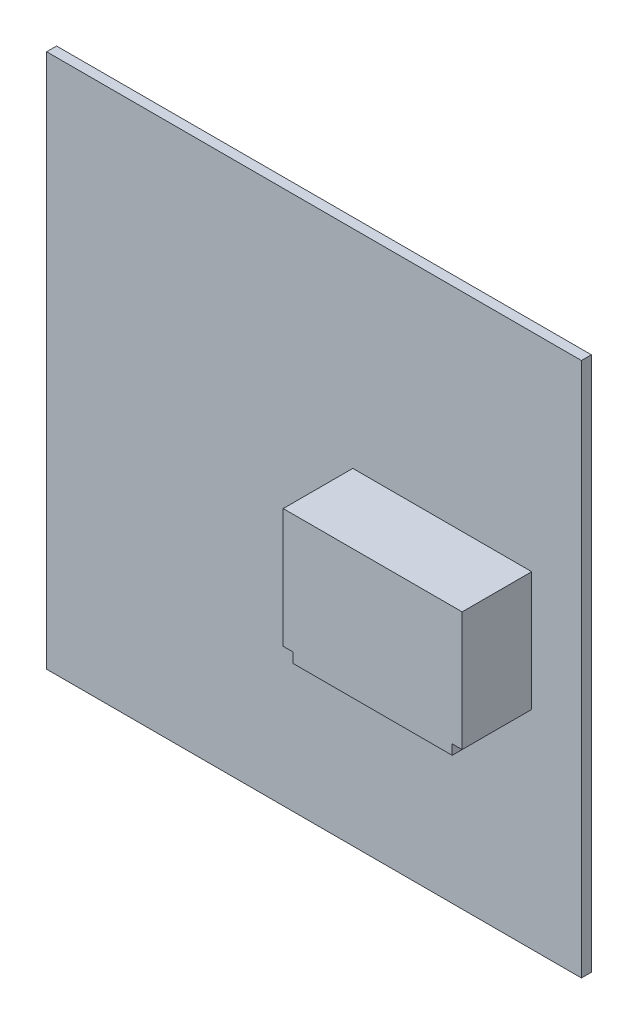
ISO-10303-21;
HEADER;
FILE_DESCRIPTION(('STEP AP214'),'2;1');
FILE_NAME('part.step','',(''),(''),'','','');
FILE_SCHEMA(('AUTOMOTIVE_DESIGN { 1 0 10303 214 1 1 1 1 }'));
ENDSEC;
DATA;
#1=APPLICATION_CONTEXT('core data for automotive mechanical design processes');
#2=APPLICATION_PROTOCOL_DEFINITION('international standard','automotive_design',2000,#1);
#3=PRODUCT_CONTEXT('',#1,'mechanical');
#4=PRODUCT('Part','Part','',(#3));
#5=PRODUCT_RELATED_PRODUCT_CATEGORY('part','',(#4));
#6=PRODUCT_DEFINITION_FORMATION('','',#4);
#7=PRODUCT_DEFINITION_CONTEXT('part definition',#1,'design');
#8=PRODUCT_DEFINITION('design','',#6,#7);
#9=PRODUCT_DEFINITION_SHAPE('','',#8);
#10=(LENGTH_UNIT() NAMED_UNIT(*) SI_UNIT(.MILLI.,.METRE.));
#11=(NAMED_UNIT(*) PLANE_ANGLE_UNIT() SI_UNIT($,.RADIAN.));
#12=(NAMED_UNIT(*) SI_UNIT($,.STERADIAN.) SOLID_ANGLE_UNIT());
#13=UNCERTAINTY_MEASURE_WITH_UNIT(LENGTH_MEASURE(1.E-05),#10,'distance_accuracy_value','');
#14=(GEOMETRIC_REPRESENTATION_CONTEXT(3) GLOBAL_UNCERTAINTY_ASSIGNED_CONTEXT((#13)) GLOBAL_UNIT_ASSIGNED_CONTEXT((#10,
#11,#12)) REPRESENTATION_CONTEXT('',''));
#15=CARTESIAN_POINT('',(0.,0.,0.));
#16=DIRECTION('',(0.,0.,1.));
#17=DIRECTION('',(1.,0.,0.));
#18=AXIS2_PLACEMENT_3D('',#15,#16,#17);
#19=CARTESIAN_POINT('',(403.86,252.73,0.));
#20=DIRECTION('',(-1.,0.,0.));
#21=DIRECTION('',(0.,0.,-1.));
#22=AXIS2_PLACEMENT_3D('',#19,#20,#21);
#23=PLANE('',#22);
#24=DIRECTION('',(0.,1.,0.));
#25=VECTOR('',#24,1.);
#26=CARTESIAN_POINT('',(403.86,252.73,0.));
#27=LINE('',#26,#25);
#28=CARTESIAN_POINT('',(403.86,252.73,0.));
#29=VERTEX_POINT('',#28);
#30=CARTESIAN_POINT('',(403.86,265.43,0.));
#31=VERTEX_POINT('',#30);
#32=EDGE_CURVE('E211',#29,#31,#27,.T.);
#33=ORIENTED_EDGE('',*,*,#32,.F.);
#34=DIRECTION('',(0.,0.,-1.));
#35=VECTOR('',#34,1.);
#36=CARTESIAN_POINT('',(403.86,252.73,0.));
#37=LINE('',#36,#35);
#38=CARTESIAN_POINT('',(403.86,252.73,88.9));
#39=VERTEX_POINT('',#38);
#40=EDGE_CURVE('E202',#39,#29,#37,.T.);
#41=ORIENTED_EDGE('',*,*,#40,.F.);
#42=DIRECTION('',(0.,1.,0.));
#43=VECTOR('',#42,1.);
#44=CARTESIAN_POINT('',(403.86,252.73,88.9));
#45=LINE('',#44,#43);
#46=CARTESIAN_POINT('',(403.86,265.43,88.9));
#47=VERTEX_POINT('',#46);
#48=EDGE_CURVE('E366',#39,#47,#45,.T.);
#49=ORIENTED_EDGE('',*,*,#48,.T.);
#50=DIRECTION('',(0.,0.,-1.));
#51=VECTOR('',#50,1.);
#52=CARTESIAN_POINT('',(403.86,265.43,350.943007190356));
#53=LINE('',#52,#51);
#54=EDGE_CURVE('E347',#47,#31,#53,.T.);
#55=ORIENTED_EDGE('',*,*,#54,.T.);
#56=EDGE_LOOP('',(#33,#41,#49,#55));
#57=FACE_BOUND('',#56,.T.);
#58=ADVANCED_FACE('F45',(#57),#23,.T.);
#59=CARTESIAN_POINT('',(0.,0.,-12.7));
#60=DIRECTION('',(0.,0.,1.));
#61=DIRECTION('',(-1.,0.,0.));
#62=AXIS2_PLACEMENT_3D('',#59,#60,#61);
#63=PLANE('',#62);
#64=DIRECTION('',(0.,-1.,0.));
#65=VECTOR('',#64,1.);
#66=CARTESIAN_POINT('',(0.,0.,-12.7));
#67=LINE('',#66,#65);
#68=CARTESIAN_POINT('',(0.,683.26,-12.7));
#69=VERTEX_POINT('',#68);
#70=CARTESIAN_POINT('',(0.,0.,-12.7));
#71=VERTEX_POINT('',#70);
#72=EDGE_CURVE('E243',#69,#71,#67,.T.);
#73=ORIENTED_EDGE('',*,*,#72,.F.);
#74=DIRECTION('',(-1.,0.,0.));
#75=VECTOR('',#74,1.);
#76=CARTESIAN_POINT('',(0.,683.26,-12.7));
#77=LINE('',#76,#75);
#78=CARTESIAN_POINT('',(683.26,683.26,-12.7));
#79=VERTEX_POINT('',#78);
#80=EDGE_CURVE('E253',#79,#69,#77,.T.);
#81=ORIENTED_EDGE('',*,*,#80,.F.);
#82=DIRECTION('',(0.,1.,0.));
#83=VECTOR('',#82,1.);
#84=CARTESIAN_POINT('',(683.26,0.,-12.7));
#85=LINE('',#84,#83);
#86=CARTESIAN_POINT('',(683.26,0.,-12.7));
#87=VERTEX_POINT('',#86);
#88=EDGE_CURVE('E250',#87,#79,#85,.T.);
#89=ORIENTED_EDGE('',*,*,#88,.F.);
#90=DIRECTION('',(1.,0.,0.));
#91=VECTOR('',#90,1.);
#92=CARTESIAN_POINT('',(0.,0.,-12.7));
#93=LINE('',#92,#91);
#94=EDGE_CURVE('E246',#71,#87,#93,.T.);
#95=ORIENTED_EDGE('',*,*,#94,.F.);
#96=EDGE_LOOP('',(#73,#81,#89,#95));
#97=FACE_BOUND('',#96,.T.);
#98=DIRECTION('',(0.,-1.,0.));
#99=VECTOR('',#98,1.);
#100=CARTESIAN_POINT('',(403.86,405.13,-12.7));
#101=LINE('',#100,#99);
#102=CARTESIAN_POINT('',(403.86,405.13,-12.7));
#103=VERTEX_POINT('',#102);
#104=CARTESIAN_POINT('',(403.86,278.13,-12.7));
#105=VERTEX_POINT('',#104);
#106=EDGE_CURVE('E216',#103,#105,#101,.T.);
#107=ORIENTED_EDGE('',*,*,#106,.T.);
#108=DIRECTION('',(1.,0.,0.));
#109=VECTOR('',#108,1.);
#110=CARTESIAN_POINT('',(403.86,278.13,-12.7));
#111=LINE('',#110,#109);
#112=CARTESIAN_POINT('',(607.06,278.13,-12.7));
#113=VERTEX_POINT('',#112);
#114=EDGE_CURVE('E221',#105,#113,#111,.T.);
#115=ORIENTED_EDGE('',*,*,#114,.T.);
#116=DIRECTION('',(0.,1.,0.));
#117=VECTOR('',#116,1.);
#118=CARTESIAN_POINT('',(607.06,405.13,-12.7));
#119=LINE('',#118,#117);
#120=CARTESIAN_POINT('',(607.06,405.13,-12.7));
#121=VERTEX_POINT('',#120);
#122=EDGE_CURVE('E224',#113,#121,#119,.T.);
#123=ORIENTED_EDGE('',*,*,#122,.T.);
#124=DIRECTION('',(-1.,0.,0.));
#125=VECTOR('',#124,1.);
#126=CARTESIAN_POINT('',(403.86,405.13,-12.7));
#127=LINE('',#126,#125);
#128=EDGE_CURVE('E227',#121,#103,#127,.T.);
#129=ORIENTED_EDGE('',*,*,#128,.T.);
#130=EDGE_LOOP('',(#107,#115,#123,#129));
#131=FACE_BOUND('',#130,.T.);
#132=ADVANCED_FACE('F284',(#97,#131),#63,.F.);
#133=CARTESIAN_POINT('',(0.,0.,0.));
#134=DIRECTION('',(0.,0.,1.));
#135=DIRECTION('',(-1.,0.,0.));
#136=AXIS2_PLACEMENT_3D('',#133,#134,#135);
#137=PLANE('',#136);
#138=DIRECTION('',(1.,0.,0.));
#139=VECTOR('',#138,1.);
#140=CARTESIAN_POINT('',(0.,265.43,0.));
#141=LINE('',#140,#139);
#142=CARTESIAN_POINT('',(607.06,265.43,0.));
#143=VERTEX_POINT('',#142);
#144=CARTESIAN_POINT('',(619.76,265.43,0.));
#145=VERTEX_POINT('',#144);
#146=EDGE_CURVE('E175',#143,#145,#141,.T.);
#147=ORIENTED_EDGE('',*,*,#146,.F.);
#148=DIRECTION('',(0.,1.,0.));
#149=VECTOR('',#148,1.);
#150=CARTESIAN_POINT('',(607.06,252.73,0.));
#151=LINE('',#150,#149);
#152=CARTESIAN_POINT('',(607.06,252.73,0.));
#153=VERTEX_POINT('',#152);
#154=EDGE_CURVE('E213',#153,#143,#151,.T.);
#155=ORIENTED_EDGE('',*,*,#154,.F.);
#156=DIRECTION('',(1.,0.,0.));
#157=VECTOR('',#156,1.);
#158=CARTESIAN_POINT('',(403.86,252.73,0.));
#159=LINE('',#158,#157);
#160=EDGE_CURVE('E205',#29,#153,#159,.T.);
#161=ORIENTED_EDGE('',*,*,#160,.F.);
#162=ORIENTED_EDGE('',*,*,#32,.T.);
#163=DIRECTION('',(-1.,0.,0.));
#164=VECTOR('',#163,1.);
#165=CARTESIAN_POINT('',(0.,265.43,0.));
#166=LINE('',#165,#164);
#167=CARTESIAN_POINT('',(391.16,265.43,0.));
#168=VERTEX_POINT('',#167);
#169=EDGE_CURVE('E183',#31,#168,#166,.T.);
#170=ORIENTED_EDGE('',*,*,#169,.T.);
#171=DIRECTION('',(0.,1.,0.));
#172=VECTOR('',#171,1.);
#173=CARTESIAN_POINT('',(391.16,0.,0.));
#174=LINE('',#173,#172);
#175=CARTESIAN_POINT('',(391.16,417.83,0.));
#176=VERTEX_POINT('',#175);
#177=EDGE_CURVE('E344',#168,#176,#174,.T.);
#178=ORIENTED_EDGE('',*,*,#177,.T.);
#179=DIRECTION('',(1.,0.,0.));
#180=VECTOR('',#179,1.);
#181=CARTESIAN_POINT('',(0.,417.83,0.));
#182=LINE('',#181,#180);
#183=CARTESIAN_POINT('',(619.76,417.83,0.));
#184=VERTEX_POINT('',#183);
#185=EDGE_CURVE('E341',#176,#184,#182,.T.);
#186=ORIENTED_EDGE('',*,*,#185,.T.);
#187=DIRECTION('',(0.,-1.,0.));
#188=VECTOR('',#187,1.);
#189=CARTESIAN_POINT('',(619.76,0.,0.));
#190=LINE('',#189,#188);
#191=EDGE_CURVE('E171',#184,#145,#190,.T.);
#192=ORIENTED_EDGE('',*,*,#191,.T.);
#193=EDGE_LOOP('',(#147,#155,#161,#162,#170,#178,#186,#192));
#194=FACE_BOUND('',#193,.T.);
#195=DIRECTION('',(0.,-1.,0.));
#196=VECTOR('',#195,1.);
#197=CARTESIAN_POINT('',(0.,0.,0.));
#198=LINE('',#197,#196);
#199=CARTESIAN_POINT('',(0.,683.26,0.));
#200=VERTEX_POINT('',#199);
#201=CARTESIAN_POINT('',(0.,0.,0.));
#202=VERTEX_POINT('',#201);
#203=EDGE_CURVE('E242',#200,#202,#198,.T.);
#204=ORIENTED_EDGE('',*,*,#203,.T.);
#205=DIRECTION('',(1.,0.,0.));
#206=VECTOR('',#205,1.);
#207=CARTESIAN_POINT('',(0.,0.,0.));
#208=LINE('',#207,#206);
#209=CARTESIAN_POINT('',(683.26,0.,0.));
#210=VERTEX_POINT('',#209);
#211=EDGE_CURVE('E259',#202,#210,#208,.T.);
#212=ORIENTED_EDGE('',*,*,#211,.T.);
#213=DIRECTION('',(0.,1.,0.));
#214=VECTOR('',#213,1.);
#215=CARTESIAN_POINT('',(683.26,0.,0.));
#216=LINE('',#215,#214);
#217=CARTESIAN_POINT('',(683.26,683.26,0.));
#218=VERTEX_POINT('',#217);
#219=EDGE_CURVE('E262',#210,#218,#216,.T.);
#220=ORIENTED_EDGE('',*,*,#219,.T.);
#221=DIRECTION('',(-1.,0.,0.));
#222=VECTOR('',#221,1.);
#223=CARTESIAN_POINT('',(0.,683.26,0.));
#224=LINE('',#223,#222);
#225=EDGE_CURVE('E247',#218,#200,#224,.T.);
#226=ORIENTED_EDGE('',*,*,#225,.T.);
#227=EDGE_LOOP('',(#204,#212,#220,#226));
#228=FACE_BOUND('',#227,.T.);
#229=ADVANCED_FACE('F279',(#194,#228),#137,.T.);
#230=CARTESIAN_POINT('',(0.,0.,-12.7));
#231=DIRECTION('',(1.,0.,0.));
#232=DIRECTION('',(0.,0.,1.));
#233=AXIS2_PLACEMENT_3D('',#230,#231,#232);
#234=PLANE('',#233);
#235=ORIENTED_EDGE('',*,*,#203,.F.);
#236=DIRECTION('',(0.,0.,1.));
#237=VECTOR('',#236,1.);
#238=CARTESIAN_POINT('',(0.,683.26,-12.7));
#239=LINE('',#238,#237);
#240=EDGE_CURVE('E256',#69,#200,#239,.T.);
#241=ORIENTED_EDGE('',*,*,#240,.F.);
#242=ORIENTED_EDGE('',*,*,#72,.T.);
#243=DIRECTION('',(0.,0.,1.));
#244=VECTOR('',#243,1.);
#245=CARTESIAN_POINT('',(0.,0.,-12.7));
#246=LINE('',#245,#244);
#247=EDGE_CURVE('E11',#71,#202,#246,.T.);
#248=ORIENTED_EDGE('',*,*,#247,.T.);
#249=EDGE_LOOP('',(#235,#241,#242,#248));
#250=FACE_BOUND('',#249,.T.);
#251=ADVANCED_FACE('F47',(#250),#234,.F.);
#252=CARTESIAN_POINT('',(0.,0.,-12.7));
#253=DIRECTION('',(0.,1.,0.));
#254=DIRECTION('',(0.,0.,-1.));
#255=AXIS2_PLACEMENT_3D('',#252,#253,#254);
#256=PLANE('',#255);
#257=ORIENTED_EDGE('',*,*,#211,.F.);
#258=ORIENTED_EDGE('',*,*,#247,.F.);
#259=ORIENTED_EDGE('',*,*,#94,.T.);
#260=DIRECTION('',(0.,0.,1.));
#261=VECTOR('',#260,1.);
#262=CARTESIAN_POINT('',(683.26,0.,-12.7));
#263=LINE('',#262,#261);
#264=EDGE_CURVE('E53',#87,#210,#263,.T.);
#265=ORIENTED_EDGE('',*,*,#264,.T.);
#266=EDGE_LOOP('',(#257,#258,#259,#265));
#267=FACE_BOUND('',#266,.T.);
#268=ADVANCED_FACE('F272',(#267),#256,.F.);
#269=CARTESIAN_POINT('',(683.26,0.,-12.7));
#270=DIRECTION('',(-1.,0.,0.));
#271=DIRECTION('',(0.,0.,-1.));
#272=AXIS2_PLACEMENT_3D('',#269,#270,#271);
#273=PLANE('',#272);
#274=ORIENTED_EDGE('',*,*,#219,.F.);
#275=ORIENTED_EDGE('',*,*,#264,.F.);
#276=ORIENTED_EDGE('',*,*,#88,.T.);
#277=DIRECTION('',(0.,0.,1.));
#278=VECTOR('',#277,1.);
#279=CARTESIAN_POINT('',(683.26,683.26,-12.7));
#280=LINE('',#279,#278);
#281=EDGE_CURVE('E268',#79,#218,#280,.T.);
#282=ORIENTED_EDGE('',*,*,#281,.T.);
#283=EDGE_LOOP('',(#274,#275,#276,#282));
#284=FACE_BOUND('',#283,.T.);
#285=ADVANCED_FACE('F276',(#284),#273,.F.);
#286=CARTESIAN_POINT('',(0.,683.26,-12.7));
#287=DIRECTION('',(0.,-1.,0.));
#288=DIRECTION('',(1.,0.,0.));
#289=AXIS2_PLACEMENT_3D('',#286,#287,#288);
#290=PLANE('',#289);
#291=ORIENTED_EDGE('',*,*,#225,.F.);
#292=ORIENTED_EDGE('',*,*,#281,.F.);
#293=ORIENTED_EDGE('',*,*,#80,.T.);
#294=ORIENTED_EDGE('',*,*,#240,.T.);
#295=EDGE_LOOP('',(#291,#292,#293,#294));
#296=FACE_BOUND('',#295,.T.);
#297=ADVANCED_FACE('F288',(#296),#290,.F.);
#298=CARTESIAN_POINT('',(403.86,405.13,-12.7));
#299=DIRECTION('',(1.,0.,0.));
#300=DIRECTION('',(0.,1.,0.));
#301=AXIS2_PLACEMENT_3D('',#298,#299,#300);
#302=PLANE('',#301);
#303=DIRECTION('',(0.,0.,1.));
#304=VECTOR('',#303,1.);
#305=CARTESIAN_POINT('',(403.86,278.13,-12.7));
#306=LINE('',#305,#304);
#307=CARTESIAN_POINT('',(403.86,278.13,76.2));
#308=VERTEX_POINT('',#307);
#309=EDGE_CURVE('E239',#105,#308,#306,.T.);
#310=ORIENTED_EDGE('',*,*,#309,.F.);
#311=ORIENTED_EDGE('',*,*,#106,.F.);
#312=DIRECTION('',(0.,0.,1.));
#313=VECTOR('',#312,1.);
#314=CARTESIAN_POINT('',(403.86,405.13,-12.7));
#315=LINE('',#314,#313);
#316=CARTESIAN_POINT('',(403.86,405.13,76.2));
#317=VERTEX_POINT('',#316);
#318=EDGE_CURVE('E230',#103,#317,#315,.T.);
#319=ORIENTED_EDGE('',*,*,#318,.T.);
#320=DIRECTION('',(0.,-1.,0.));
#321=VECTOR('',#320,1.);
#322=CARTESIAN_POINT('',(403.86,1.765254609154E-13,76.2));
#323=LINE('',#322,#321);
#324=EDGE_CURVE('E332',#317,#308,#323,.T.);
#325=ORIENTED_EDGE('',*,*,#324,.T.);
#326=EDGE_LOOP('',(#310,#311,#319,#325));
#327=FACE_BOUND('',#326,.T.);
#328=ADVANCED_FACE('F290',(#327),#302,.T.);
#329=CARTESIAN_POINT('',(403.86,278.13,-12.7));
#330=DIRECTION('',(0.,1.,0.));
#331=DIRECTION('',(0.,0.,-1.));
#332=AXIS2_PLACEMENT_3D('',#329,#330,#331);
#333=PLANE('',#332);
#334=CARTESIAN_POINT('',(566.42,278.13,38.1));
#335=DIRECTION('',(0.,-1.,0.));
#336=DIRECTION('',(0.,0.,-1.));
#337=AXIS2_PLACEMENT_3D('',#334,#335,#336);
#338=CIRCLE('',#337,23.6855);
#339=CARTESIAN_POINT('',(566.42,278.13,14.4145));
#340=VERTEX_POINT('',#339);
#341=EDGE_CURVE('E188',#340,#340,#338,.T.);
#342=ORIENTED_EDGE('',*,*,#341,.T.);
#343=EDGE_LOOP('',(#342));
#344=FACE_BOUND('',#343,.T.);
#345=CARTESIAN_POINT('',(502.92,278.13,38.1));
#346=DIRECTION('',(0.,-1.,0.));
#347=DIRECTION('',(0.,0.,-1.));
#348=AXIS2_PLACEMENT_3D('',#345,#346,#347);
#349=CIRCLE('',#348,19.3674999999999);
#350=CARTESIAN_POINT('',(502.92,278.13,18.7325000000001));
#351=VERTEX_POINT('',#350);
#352=EDGE_CURVE('E194',#351,#351,#349,.T.);
#353=ORIENTED_EDGE('',*,*,#352,.T.);
#354=EDGE_LOOP('',(#353));
#355=FACE_BOUND('',#354,.T.);
#356=CARTESIAN_POINT('',(441.96,278.13,38.1));
#357=DIRECTION('',(0.,-1.,0.));
#358=DIRECTION('',(0.,0.,-1.));
#359=AXIS2_PLACEMENT_3D('',#356,#357,#358);
#360=CIRCLE('',#359,16.0655);
#361=CARTESIAN_POINT('',(441.96,278.13,22.0345));
#362=VERTEX_POINT('',#361);
#363=EDGE_CURVE('E182',#362,#362,#360,.T.);
#364=ORIENTED_EDGE('',*,*,#363,.T.);
#365=EDGE_LOOP('',(#364));
#366=FACE_BOUND('',#365,.T.);
#367=DIRECTION('',(0.,0.,1.));
#368=VECTOR('',#367,1.);
#369=CARTESIAN_POINT('',(607.06,278.13,-12.7));
#370=LINE('',#369,#368);
#371=CARTESIAN_POINT('',(607.06,278.13,76.2));
#372=VERTEX_POINT('',#371);
#373=EDGE_CURVE('E236',#113,#372,#370,.T.);
#374=ORIENTED_EDGE('',*,*,#373,.F.);
#375=ORIENTED_EDGE('',*,*,#114,.F.);
#376=ORIENTED_EDGE('',*,*,#309,.T.);
#377=DIRECTION('',(-1.,0.,0.));
#378=VECTOR('',#377,1.);
#379=CARTESIAN_POINT('',(403.86,278.13,76.2));
#380=LINE('',#379,#378);
#381=EDGE_CURVE('E187',#372,#308,#380,.T.);
#382=ORIENTED_EDGE('',*,*,#381,.F.);
#383=EDGE_LOOP('',(#374,#375,#376,#382));
#384=FACE_BOUND('',#383,.T.);
#385=ADVANCED_FACE('F296',(#344,#355,#366,#384),#333,.T.);
#386=CARTESIAN_POINT('',(607.06,405.13,-12.7));
#387=DIRECTION('',(-1.,0.,0.));
#388=DIRECTION('',(0.,0.,-1.));
#389=AXIS2_PLACEMENT_3D('',#386,#387,#388);
#390=PLANE('',#389);
#391=DIRECTION('',(0.,0.,1.));
#392=VECTOR('',#391,1.);
#393=CARTESIAN_POINT('',(607.06,405.13,-12.7));
#394=LINE('',#393,#392);
#395=CARTESIAN_POINT('',(607.06,405.13,76.2));
#396=VERTEX_POINT('',#395);
#397=EDGE_CURVE('E233',#121,#396,#394,.T.);
#398=ORIENTED_EDGE('',*,*,#397,.F.);
#399=ORIENTED_EDGE('',*,*,#122,.F.);
#400=ORIENTED_EDGE('',*,*,#373,.T.);
#401=DIRECTION('',(0.,1.,0.));
#402=VECTOR('',#401,1.);
#403=CARTESIAN_POINT('',(607.06,0.,76.2));
#404=LINE('',#403,#402);
#405=EDGE_CURVE('E350',#372,#396,#404,.T.);
#406=ORIENTED_EDGE('',*,*,#405,.T.);
#407=EDGE_LOOP('',(#398,#399,#400,#406));
#408=FACE_BOUND('',#407,.T.);
#409=ADVANCED_FACE('F316',(#408),#390,.T.);
#410=CARTESIAN_POINT('',(403.86,405.13,-12.7));
#411=DIRECTION('',(0.,-1.,0.));
#412=DIRECTION('',(1.,0.,0.));
#413=AXIS2_PLACEMENT_3D('',#410,#411,#412);
#414=PLANE('',#413);
#415=ORIENTED_EDGE('',*,*,#318,.F.);
#416=ORIENTED_EDGE('',*,*,#128,.F.);
#417=ORIENTED_EDGE('',*,*,#397,.T.);
#418=DIRECTION('',(-1.,0.,0.));
#419=VECTOR('',#418,1.);
#420=CARTESIAN_POINT('',(-2.2135071553464E-13,405.13,76.2));
#421=LINE('',#420,#419);
#422=EDGE_CURVE('E335',#396,#317,#421,.T.);
#423=ORIENTED_EDGE('',*,*,#422,.T.);
#424=EDGE_LOOP('',(#415,#416,#417,#423));
#425=FACE_BOUND('',#424,.T.);
#426=ADVANCED_FACE('F313',(#425),#414,.T.);
#427=CARTESIAN_POINT('',(607.06,252.73,0.));
#428=DIRECTION('',(1.,0.,0.));
#429=DIRECTION('',(0.,0.,1.));
#430=AXIS2_PLACEMENT_3D('',#427,#428,#429);
#431=PLANE('',#430);
#432=DIRECTION('',(0.,0.,-1.));
#433=VECTOR('',#432,1.);
#434=CARTESIAN_POINT('',(607.06,265.43,350.943007190356));
#435=LINE('',#434,#433);
#436=CARTESIAN_POINT('',(607.06,265.43,88.9));
#437=VERTEX_POINT('',#436);
#438=EDGE_CURVE('E180',#437,#143,#435,.T.);
#439=ORIENTED_EDGE('',*,*,#438,.F.);
#440=DIRECTION('',(0.,-1.,0.));
#441=VECTOR('',#440,1.);
#442=CARTESIAN_POINT('',(607.06,265.43,88.9));
#443=LINE('',#442,#441);
#444=CARTESIAN_POINT('',(607.06,252.73,88.9));
#445=VERTEX_POINT('',#444);
#446=EDGE_CURVE('E369',#437,#445,#443,.T.);
#447=ORIENTED_EDGE('',*,*,#446,.T.);
#448=DIRECTION('',(0.,0.,1.));
#449=VECTOR('',#448,1.);
#450=CARTESIAN_POINT('',(607.06,252.73,0.));
#451=LINE('',#450,#449);
#452=EDGE_CURVE('E208',#153,#445,#451,.T.);
#453=ORIENTED_EDGE('',*,*,#452,.F.);
#454=ORIENTED_EDGE('',*,*,#154,.T.);
#455=EDGE_LOOP('',(#439,#447,#453,#454));
#456=FACE_BOUND('',#455,.T.);
#457=ADVANCED_FACE('F311',(#456),#431,.T.);
#458=CARTESIAN_POINT('',(0.,252.73,0.));
#459=DIRECTION('',(0.,-1.,0.));
#460=DIRECTION('',(0.,0.,1.));
#461=AXIS2_PLACEMENT_3D('',#458,#459,#460);
#462=PLANE('',#461);
#463=ORIENTED_EDGE('',*,*,#40,.T.);
#464=ORIENTED_EDGE('',*,*,#160,.T.);
#465=ORIENTED_EDGE('',*,*,#452,.T.);
#466=DIRECTION('',(-1.,0.,0.));
#467=VECTOR('',#466,1.);
#468=CARTESIAN_POINT('',(607.06,252.73,88.9));
#469=LINE('',#468,#467);
#470=EDGE_CURVE('E367',#445,#39,#469,.T.);
#471=ORIENTED_EDGE('',*,*,#470,.T.);
#472=EDGE_LOOP('',(#463,#464,#465,#471));
#473=FACE_BOUND('',#472,.T.);
#474=ADVANCED_FACE('F378',(#473),#462,.T.);
#475=CARTESIAN_POINT('',(441.96,259.08,38.1));
#476=DIRECTION('',(0.,1.,0.));
#477=DIRECTION('',(0.,0.,-1.));
#478=AXIS2_PLACEMENT_3D('',#475,#476,#477);
#479=CYLINDRICAL_SURFACE('',#478,16.0655);
#480=CARTESIAN_POINT('',(441.96,259.08,38.1));
#481=DIRECTION('',(0.,-1.,0.));
#482=DIRECTION('',(0.,0.,-1.));
#483=AXIS2_PLACEMENT_3D('',#480,#481,#482);
#484=CIRCLE('',#483,16.0655);
#485=CARTESIAN_POINT('',(441.96,259.08,22.0345));
#486=VERTEX_POINT('',#485);
#487=EDGE_CURVE('E197',#486,#486,#484,.T.);
#488=CARTESIAN_POINT('',(441.96,259.08,22.0345));
#489=CARTESIAN_POINT('',(441.96,259.2784375,22.0345));
#490=CARTESIAN_POINT('',(441.96,259.476875,22.0345));
#491=CARTESIAN_POINT('',(441.96,259.87375,22.0345));
#492=CARTESIAN_POINT('',(441.96,260.0721875,22.0345));
#493=CARTESIAN_POINT('',(441.96,260.4690625,22.0345));
#494=CARTESIAN_POINT('',(441.96,260.6675,22.0345));
#495=CARTESIAN_POINT('',(441.96,261.064375,22.0345));
#496=CARTESIAN_POINT('',(441.96,261.2628125,22.0345));
#497=CARTESIAN_POINT('',(441.96,261.6596875,22.0345));
#498=CARTESIAN_POINT('',(441.96,261.858125,22.0345));
#499=CARTESIAN_POINT('',(441.96,262.255,22.0345));
#500=CARTESIAN_POINT('',(441.96,262.4534375,22.0345));
#501=CARTESIAN_POINT('',(441.96,262.8503125,22.0345));
#502=CARTESIAN_POINT('',(441.96,263.04875,22.0345));
#503=CARTESIAN_POINT('',(441.96,263.445625,22.0345));
#504=CARTESIAN_POINT('',(441.96,263.6440625,22.0345));
#505=CARTESIAN_POINT('',(441.96,264.0409375,22.0345));
#506=CARTESIAN_POINT('',(441.96,264.239375,22.0345));
#507=CARTESIAN_POINT('',(441.96,264.63625,22.0345));
#508=CARTESIAN_POINT('',(441.96,264.8346875,22.0345));
#509=CARTESIAN_POINT('',(441.96,265.2315625,22.0345));
#510=CARTESIAN_POINT('',(441.96,265.43,22.0345));
#511=CARTESIAN_POINT('',(441.96,265.826875,22.0345));
#512=CARTESIAN_POINT('',(441.96,266.0253125,22.0345));
#513=CARTESIAN_POINT('',(441.96,266.4221875,22.0345));
#514=CARTESIAN_POINT('',(441.96,266.620625,22.0345));
#515=CARTESIAN_POINT('',(441.96,267.0175,22.0345));
#516=CARTESIAN_POINT('',(441.96,267.2159375,22.0345));
#517=CARTESIAN_POINT('',(441.96,267.6128125,22.0345));
#518=CARTESIAN_POINT('',(441.96,267.81125,22.0345));
#519=CARTESIAN_POINT('',(441.96,268.208125,22.0345));
#520=CARTESIAN_POINT('',(441.96,268.4065625,22.0345));
#521=CARTESIAN_POINT('',(441.96,268.8034375,22.0345));
#522=CARTESIAN_POINT('',(441.96,269.001875,22.0345));
#523=CARTESIAN_POINT('',(441.96,269.39875,22.0345));
#524=CARTESIAN_POINT('',(441.96,269.5971875,22.0345));
#525=CARTESIAN_POINT('',(441.96,269.9940625,22.0345));
#526=CARTESIAN_POINT('',(441.96,270.1925,22.0345));
#527=CARTESIAN_POINT('',(441.96,270.589375,22.0345));
#528=CARTESIAN_POINT('',(441.96,270.7878125,22.0345));
#529=CARTESIAN_POINT('',(441.96,271.1846875,22.0345));
#530=CARTESIAN_POINT('',(441.96,271.383125,22.0345));
#531=CARTESIAN_POINT('',(441.96,271.78,22.0345));
#532=CARTESIAN_POINT('',(441.96,271.9784375,22.0345));
#533=CARTESIAN_POINT('',(441.96,272.3753125,22.0345));
#534=CARTESIAN_POINT('',(441.96,272.57375,22.0345));
#535=CARTESIAN_POINT('',(441.96,272.970625,22.0345));
#536=CARTESIAN_POINT('',(441.96,273.1690625,22.0345));
#537=CARTESIAN_POINT('',(441.96,273.5659375,22.0345));
#538=CARTESIAN_POINT('',(441.96,273.764375,22.0345));
#539=CARTESIAN_POINT('',(441.96,274.16125,22.0345));
#540=CARTESIAN_POINT('',(441.96,274.3596875,22.0345));
#541=CARTESIAN_POINT('',(441.96,274.7565625,22.0345));
#542=CARTESIAN_POINT('',(441.96,274.955,22.0345));
#543=CARTESIAN_POINT('',(441.96,275.351875,22.0345));
#544=CARTESIAN_POINT('',(441.96,275.5503125,22.0345));
#545=CARTESIAN_POINT('',(441.96,275.9471875,22.0345));
#546=CARTESIAN_POINT('',(441.96,276.145625,22.0345));
#547=CARTESIAN_POINT('',(441.96,276.5425,22.0345));
#548=CARTESIAN_POINT('',(441.96,276.7409375,22.0345));
#549=CARTESIAN_POINT('',(441.96,277.1378125,22.0345));
#550=CARTESIAN_POINT('',(441.96,277.33625,22.0345));
#551=CARTESIAN_POINT('',(441.96,277.733125,22.0345));
#552=CARTESIAN_POINT('',(441.96,277.9315625,22.0345));
#553=CARTESIAN_POINT('',(441.96,278.13,22.0345));
#554=B_SPLINE_CURVE_WITH_KNOTS('',3,(#488,#489,#490,#491,#492,#493,#494,#495,#496,#497,#498,
#499,#500,#501,#502,#503,#504,#505,#506,#507,#508,#509,#510,#511,#512,#513,#514,#515,#516,#517,
#518,#519,#520,#521,#522,#523,#524,#525,#526,#527,#528,#529,#530,#531,#532,#533,#534,#535,#536,
#537,#538,#539,#540,#541,#542,#543,#544,#545,#546,#547,#548,#549,#550,#551,#552,#553),
.UNSPECIFIED.,.F.,.F.,(4,2,2,2,2,2,2,2,2,2,2,2,2,2,2,2,2,2,2,2,2,2,2,2,2,2,2,2,2,2,2,2,4),(0.,
0.5953125,1.190625,1.7859375,2.38125,2.9765625,3.571875,4.1671875,4.7625,5.3578125,5.953125,
6.5484375,7.14375,7.7390625,8.334375,8.92968750000001,9.52500000000001,10.1203125,10.715625,
11.3109375,11.90625,12.5015625,13.096875,13.6921875,14.2875,14.8828125,15.478125,16.0734375,
16.66875,17.2640625,17.859375,18.4546875,19.05),.UNSPECIFIED.);
#555=EDGE_CURVE('BSEAM380',#486,#362,#554,.T.);
#556=ORIENTED_EDGE('',*,*,#487,.T.);
#557=ORIENTED_EDGE('',*,*,#363,.F.);
#558=ORIENTED_EDGE('',*,*,#555,.T.);
#559=ORIENTED_EDGE('',*,*,#555,.F.);
#560=EDGE_LOOP('',(#556,#558,#557,#559));
#561=FACE_BOUND('',#560,.T.);
#562=ADVANCED_FACE('F380',(#561),#479,.F.);
#563=CARTESIAN_POINT('',(0.,259.08,0.));
#564=DIRECTION('',(0.,1.,0.));
#565=DIRECTION('',(0.,0.,-1.));
#566=AXIS2_PLACEMENT_3D('',#563,#564,#565);
#567=PLANE('',#566);
#568=ORIENTED_EDGE('',*,*,#487,.F.);
#569=EDGE_LOOP('',(#568));
#570=FACE_BOUND('',#569,.T.);
#571=ADVANCED_FACE('F385',(#570),#567,.T.);
#572=CARTESIAN_POINT('',(502.92,259.08,38.1));
#573=DIRECTION('',(0.,1.,0.));
#574=DIRECTION('',(0.,0.,-1.));
#575=AXIS2_PLACEMENT_3D('',#572,#573,#574);
#576=CYLINDRICAL_SURFACE('',#575,19.3674999999999);
#577=CARTESIAN_POINT('',(502.92,259.08,38.1));
#578=DIRECTION('',(0.,-1.,0.));
#579=DIRECTION('',(0.,0.,-1.));
#580=AXIS2_PLACEMENT_3D('',#577,#578,#579);
#581=CIRCLE('',#580,19.3674999999999);
#582=CARTESIAN_POINT('',(502.92,259.08,18.7325000000001));
#583=VERTEX_POINT('',#582);
#584=EDGE_CURVE('E191',#583,#583,#581,.T.);
#585=CARTESIAN_POINT('',(502.92,259.08,18.7325000000001));
#586=CARTESIAN_POINT('',(502.92,259.2784375,18.7325000000001));
#587=CARTESIAN_POINT('',(502.92,259.476875,18.7325000000001));
#588=CARTESIAN_POINT('',(502.92,259.87375,18.7325000000001));
#589=CARTESIAN_POINT('',(502.92,260.0721875,18.7325000000001));
#590=CARTESIAN_POINT('',(502.92,260.4690625,18.7325000000001));
#591=CARTESIAN_POINT('',(502.92,260.6675,18.7325000000001));
#592=CARTESIAN_POINT('',(502.92,261.064375,18.7325000000001));
#593=CARTESIAN_POINT('',(502.92,261.2628125,18.7325000000001));
#594=CARTESIAN_POINT('',(502.92,261.6596875,18.7325000000001));
#595=CARTESIAN_POINT('',(502.92,261.858125,18.7325000000001));
#596=CARTESIAN_POINT('',(502.92,262.255,18.7325000000001));
#597=CARTESIAN_POINT('',(502.92,262.4534375,18.7325000000001));
#598=CARTESIAN_POINT('',(502.92,262.8503125,18.7325000000001));
#599=CARTESIAN_POINT('',(502.92,263.04875,18.7325000000001));
#600=CARTESIAN_POINT('',(502.92,263.445625,18.7325000000001));
#601=CARTESIAN_POINT('',(502.92,263.6440625,18.7325000000001));
#602=CARTESIAN_POINT('',(502.92,264.0409375,18.7325000000001));
#603=CARTESIAN_POINT('',(502.92,264.239375,18.7325000000001));
#604=CARTESIAN_POINT('',(502.92,264.63625,18.7325000000001));
#605=CARTESIAN_POINT('',(502.92,264.8346875,18.7325000000001));
#606=CARTESIAN_POINT('',(502.92,265.2315625,18.7325000000001));
#607=CARTESIAN_POINT('',(502.92,265.43,18.7325000000001));
#608=CARTESIAN_POINT('',(502.92,265.826875,18.7325000000001));
#609=CARTESIAN_POINT('',(502.92,266.0253125,18.7325000000001));
#610=CARTESIAN_POINT('',(502.92,266.4221875,18.7325000000001));
#611=CARTESIAN_POINT('',(502.92,266.620625,18.7325000000001));
#612=CARTESIAN_POINT('',(502.92,267.0175,18.7325000000001));
#613=CARTESIAN_POINT('',(502.92,267.2159375,18.7325000000001));
#614=CARTESIAN_POINT('',(502.92,267.6128125,18.7325000000001));
#615=CARTESIAN_POINT('',(502.92,267.81125,18.7325000000001));
#616=CARTESIAN_POINT('',(502.92,268.208125,18.7325000000001));
#617=CARTESIAN_POINT('',(502.92,268.4065625,18.7325000000001));
#618=CARTESIAN_POINT('',(502.92,268.8034375,18.7325000000001));
#619=CARTESIAN_POINT('',(502.92,269.001875,18.7325000000001));
#620=CARTESIAN_POINT('',(502.92,269.39875,18.7325000000001));
#621=CARTESIAN_POINT('',(502.92,269.5971875,18.7325000000001));
#622=CARTESIAN_POINT('',(502.92,269.9940625,18.7325000000001));
#623=CARTESIAN_POINT('',(502.92,270.1925,18.7325000000001));
#624=CARTESIAN_POINT('',(502.92,270.589375,18.7325000000001));
#625=CARTESIAN_POINT('',(502.92,270.7878125,18.7325000000001));
#626=CARTESIAN_POINT('',(502.92,271.1846875,18.7325000000001));
#627=CARTESIAN_POINT('',(502.92,271.383125,18.7325000000001));
#628=CARTESIAN_POINT('',(502.92,271.78,18.7325000000001));
#629=CARTESIAN_POINT('',(502.92,271.9784375,18.7325000000001));
#630=CARTESIAN_POINT('',(502.92,272.3753125,18.7325000000001));
#631=CARTESIAN_POINT('',(502.92,272.57375,18.7325000000001));
#632=CARTESIAN_POINT('',(502.92,272.970625,18.7325000000001));
#633=CARTESIAN_POINT('',(502.92,273.1690625,18.7325000000001));
#634=CARTESIAN_POINT('',(502.92,273.5659375,18.7325000000001));
#635=CARTESIAN_POINT('',(502.92,273.764375,18.7325000000001));
#636=CARTESIAN_POINT('',(502.92,274.16125,18.7325000000001));
#637=CARTESIAN_POINT('',(502.92,274.3596875,18.7325000000001));
#638=CARTESIAN_POINT('',(502.92,274.7565625,18.7325000000001));
#639=CARTESIAN_POINT('',(502.92,274.955,18.7325000000001));
#640=CARTESIAN_POINT('',(502.92,275.351875,18.7325000000001));
#641=CARTESIAN_POINT('',(502.92,275.5503125,18.7325000000001));
#642=CARTESIAN_POINT('',(502.92,275.9471875,18.7325000000001));
#643=CARTESIAN_POINT('',(502.92,276.145625,18.7325000000001));
#644=CARTESIAN_POINT('',(502.92,276.5425,18.7325000000001));
#645=CARTESIAN_POINT('',(502.92,276.7409375,18.7325000000001));
#646=CARTESIAN_POINT('',(502.92,277.1378125,18.7325000000001));
#647=CARTESIAN_POINT('',(502.92,277.33625,18.7325000000001));
#648=CARTESIAN_POINT('',(502.92,277.733125,18.7325000000001));
#649=CARTESIAN_POINT('',(502.92,277.9315625,18.7325000000001));
#650=CARTESIAN_POINT('',(502.92,278.13,18.7325000000001));
#651=B_SPLINE_CURVE_WITH_KNOTS('',3,(#585,#586,#587,#588,#589,#590,#591,#592,#593,#594,#595,
#596,#597,#598,#599,#600,#601,#602,#603,#604,#605,#606,#607,#608,#609,#610,#611,#612,#613,#614,
#615,#616,#617,#618,#619,#620,#621,#622,#623,#624,#625,#626,#627,#628,#629,#630,#631,#632,#633,
#634,#635,#636,#637,#638,#639,#640,#641,#642,#643,#644,#645,#646,#647,#648,#649,#650),
.UNSPECIFIED.,.F.,.F.,(4,2,2,2,2,2,2,2,2,2,2,2,2,2,2,2,2,2,2,2,2,2,2,2,2,2,2,2,2,2,2,2,4),(0.,
0.5953125,1.190625,1.7859375,2.38125,2.9765625,3.571875,4.1671875,4.7625,5.3578125,5.953125,
6.5484375,7.14375,7.7390625,8.334375,8.92968750000001,9.52500000000001,10.1203125,10.715625,
11.3109375,11.90625,12.5015625,13.096875,13.6921875,14.2875,14.8828125,15.478125,16.0734375,
16.66875,17.2640625,17.859375,18.4546875,19.05),.UNSPECIFIED.);
#652=EDGE_CURVE('BSEAM391',#583,#351,#651,.T.);
#653=ORIENTED_EDGE('',*,*,#584,.T.);
#654=ORIENTED_EDGE('',*,*,#352,.F.);
#655=ORIENTED_EDGE('',*,*,#652,.T.);
#656=ORIENTED_EDGE('',*,*,#652,.F.);
#657=EDGE_LOOP('',(#653,#655,#654,#656));
#658=FACE_BOUND('',#657,.T.);
#659=ADVANCED_FACE('F391',(#658),#576,.F.);
#660=CARTESIAN_POINT('',(0.,259.08,0.));
#661=DIRECTION('',(0.,1.,0.));
#662=DIRECTION('',(0.,0.,-1.));
#663=AXIS2_PLACEMENT_3D('',#660,#661,#662);
#664=PLANE('',#663);
#665=ORIENTED_EDGE('',*,*,#584,.F.);
#666=EDGE_LOOP('',(#665));
#667=FACE_BOUND('',#666,.T.);
#668=ADVANCED_FACE('F395',(#667),#664,.T.);
#669=CARTESIAN_POINT('',(566.42,259.08,38.1));
#670=DIRECTION('',(0.,1.,0.));
#671=DIRECTION('',(0.,0.,-1.));
#672=AXIS2_PLACEMENT_3D('',#669,#670,#671);
#673=CYLINDRICAL_SURFACE('',#672,23.6855);
#674=CARTESIAN_POINT('',(566.42,259.08,38.1));
#675=DIRECTION('',(0.,-1.,0.));
#676=DIRECTION('',(0.,0.,-1.));
#677=AXIS2_PLACEMENT_3D('',#674,#675,#676);
#678=CIRCLE('',#677,23.6855);
#679=CARTESIAN_POINT('',(566.42,259.08,14.4145));
#680=VERTEX_POINT('',#679);
#681=EDGE_CURVE('E184',#680,#680,#678,.T.);
#682=CARTESIAN_POINT('',(566.42,259.08,14.4145));
#683=CARTESIAN_POINT('',(566.42,259.2784375,14.4145));
#684=CARTESIAN_POINT('',(566.42,259.476875,14.4145));
#685=CARTESIAN_POINT('',(566.42,259.87375,14.4145));
#686=CARTESIAN_POINT('',(566.42,260.0721875,14.4145));
#687=CARTESIAN_POINT('',(566.42,260.4690625,14.4145));
#688=CARTESIAN_POINT('',(566.42,260.6675,14.4145));
#689=CARTESIAN_POINT('',(566.42,261.064375,14.4145));
#690=CARTESIAN_POINT('',(566.42,261.2628125,14.4145));
#691=CARTESIAN_POINT('',(566.42,261.6596875,14.4145));
#692=CARTESIAN_POINT('',(566.42,261.858125,14.4145));
#693=CARTESIAN_POINT('',(566.42,262.255,14.4145));
#694=CARTESIAN_POINT('',(566.42,262.4534375,14.4145));
#695=CARTESIAN_POINT('',(566.42,262.8503125,14.4145));
#696=CARTESIAN_POINT('',(566.42,263.04875,14.4145));
#697=CARTESIAN_POINT('',(566.42,263.445625,14.4145));
#698=CARTESIAN_POINT('',(566.42,263.6440625,14.4145));
#699=CARTESIAN_POINT('',(566.42,264.0409375,14.4145));
#700=CARTESIAN_POINT('',(566.42,264.239375,14.4145));
#701=CARTESIAN_POINT('',(566.42,264.63625,14.4145));
#702=CARTESIAN_POINT('',(566.42,264.8346875,14.4145));
#703=CARTESIAN_POINT('',(566.42,265.2315625,14.4145));
#704=CARTESIAN_POINT('',(566.42,265.43,14.4145));
#705=CARTESIAN_POINT('',(566.42,265.826875,14.4145));
#706=CARTESIAN_POINT('',(566.42,266.0253125,14.4145));
#707=CARTESIAN_POINT('',(566.42,266.4221875,14.4145));
#708=CARTESIAN_POINT('',(566.42,266.620625,14.4145));
#709=CARTESIAN_POINT('',(566.42,267.0175,14.4145));
#710=CARTESIAN_POINT('',(566.42,267.2159375,14.4145));
#711=CARTESIAN_POINT('',(566.42,267.6128125,14.4145));
#712=CARTESIAN_POINT('',(566.42,267.81125,14.4145));
#713=CARTESIAN_POINT('',(566.42,268.208125,14.4145));
#714=CARTESIAN_POINT('',(566.42,268.4065625,14.4145));
#715=CARTESIAN_POINT('',(566.42,268.8034375,14.4145));
#716=CARTESIAN_POINT('',(566.42,269.001875,14.4145));
#717=CARTESIAN_POINT('',(566.42,269.39875,14.4145));
#718=CARTESIAN_POINT('',(566.42,269.5971875,14.4145));
#719=CARTESIAN_POINT('',(566.42,269.9940625,14.4145));
#720=CARTESIAN_POINT('',(566.42,270.1925,14.4145));
#721=CARTESIAN_POINT('',(566.42,270.589375,14.4145));
#722=CARTESIAN_POINT('',(566.42,270.7878125,14.4145));
#723=CARTESIAN_POINT('',(566.42,271.1846875,14.4145));
#724=CARTESIAN_POINT('',(566.42,271.383125,14.4145));
#725=CARTESIAN_POINT('',(566.42,271.78,14.4145));
#726=CARTESIAN_POINT('',(566.42,271.9784375,14.4145));
#727=CARTESIAN_POINT('',(566.42,272.3753125,14.4145));
#728=CARTESIAN_POINT('',(566.42,272.57375,14.4145));
#729=CARTESIAN_POINT('',(566.42,272.970625,14.4145));
#730=CARTESIAN_POINT('',(566.42,273.1690625,14.4145));
#731=CARTESIAN_POINT('',(566.42,273.5659375,14.4145));
#732=CARTESIAN_POINT('',(566.42,273.764375,14.4145));
#733=CARTESIAN_POINT('',(566.42,274.16125,14.4145));
#734=CARTESIAN_POINT('',(566.42,274.3596875,14.4145));
#735=CARTESIAN_POINT('',(566.42,274.7565625,14.4145));
#736=CARTESIAN_POINT('',(566.42,274.955,14.4145));
#737=CARTESIAN_POINT('',(566.42,275.351875,14.4145));
#738=CARTESIAN_POINT('',(566.42,275.5503125,14.4145));
#739=CARTESIAN_POINT('',(566.42,275.9471875,14.4145));
#740=CARTESIAN_POINT('',(566.42,276.145625,14.4145));
#741=CARTESIAN_POINT('',(566.42,276.5425,14.4145));
#742=CARTESIAN_POINT('',(566.42,276.7409375,14.4145));
#743=CARTESIAN_POINT('',(566.42,277.1378125,14.4145));
#744=CARTESIAN_POINT('',(566.42,277.33625,14.4145));
#745=CARTESIAN_POINT('',(566.42,277.733125,14.4145));
#746=CARTESIAN_POINT('',(566.42,277.9315625,14.4145));
#747=CARTESIAN_POINT('',(566.42,278.13,14.4145));
#748=B_SPLINE_CURVE_WITH_KNOTS('',3,(#682,#683,#684,#685,#686,#687,#688,#689,#690,#691,#692,
#693,#694,#695,#696,#697,#698,#699,#700,#701,#702,#703,#704,#705,#706,#707,#708,#709,#710,#711,
#712,#713,#714,#715,#716,#717,#718,#719,#720,#721,#722,#723,#724,#725,#726,#727,#728,#729,#730,
#731,#732,#733,#734,#735,#736,#737,#738,#739,#740,#741,#742,#743,#744,#745,#746,#747),
.UNSPECIFIED.,.F.,.F.,(4,2,2,2,2,2,2,2,2,2,2,2,2,2,2,2,2,2,2,2,2,2,2,2,2,2,2,2,2,2,2,2,4),(0.,
0.5953125,1.190625,1.7859375,2.38125,2.9765625,3.571875,4.1671875,4.7625,5.3578125,5.953125,
6.5484375,7.14375,7.7390625,8.334375,8.92968750000001,9.52500000000001,10.1203125,10.715625,
11.3109375,11.90625,12.5015625,13.096875,13.6921875,14.2875,14.8828125,15.478125,16.0734375,
16.66875,17.2640625,17.859375,18.4546875,19.05),.UNSPECIFIED.);
#749=EDGE_CURVE('BSEAM399',#680,#340,#748,.T.);
#750=ORIENTED_EDGE('',*,*,#681,.T.);
#751=ORIENTED_EDGE('',*,*,#341,.F.);
#752=ORIENTED_EDGE('',*,*,#749,.T.);
#753=ORIENTED_EDGE('',*,*,#749,.F.);
#754=EDGE_LOOP('',(#750,#752,#751,#753));
#755=FACE_BOUND('',#754,.T.);
#756=ADVANCED_FACE('F399',(#755),#673,.F.);
#757=CARTESIAN_POINT('',(0.,259.08,0.));
#758=DIRECTION('',(0.,1.,0.));
#759=DIRECTION('',(0.,0.,-1.));
#760=AXIS2_PLACEMENT_3D('',#757,#758,#759);
#761=PLANE('',#760);
#762=ORIENTED_EDGE('',*,*,#681,.F.);
#763=EDGE_LOOP('',(#762));
#764=FACE_BOUND('',#763,.T.);
#765=ADVANCED_FACE('F403',(#764),#761,.T.);
#766=CARTESIAN_POINT('',(0.,265.43,350.943007190356));
#767=DIRECTION('',(0.,-1.,0.));
#768=DIRECTION('',(0.,0.,1.));
#769=AXIS2_PLACEMENT_3D('',#766,#767,#768);
#770=PLANE('',#769);
#771=ORIENTED_EDGE('',*,*,#438,.T.);
#772=ORIENTED_EDGE('',*,*,#146,.T.);
#773=DIRECTION('',(0.,0.,-1.));
#774=VECTOR('',#773,1.);
#775=CARTESIAN_POINT('',(619.76,265.43,350.943007190356));
#776=LINE('',#775,#774);
#777=CARTESIAN_POINT('',(619.76,265.43,88.9));
#778=VERTEX_POINT('',#777);
#779=EDGE_CURVE('E60',#778,#145,#776,.T.);
#780=ORIENTED_EDGE('',*,*,#779,.F.);
#781=DIRECTION('',(-1.,0.,0.));
#782=VECTOR('',#781,1.);
#783=CARTESIAN_POINT('',(619.76,265.43,88.9));
#784=LINE('',#783,#782);
#785=EDGE_CURVE('E168',#778,#437,#784,.T.);
#786=ORIENTED_EDGE('',*,*,#785,.T.);
#787=EDGE_LOOP('',(#771,#772,#780,#786));
#788=FACE_BOUND('',#787,.T.);
#789=ADVANCED_FACE('F374',(#788),#770,.T.);
#790=CARTESIAN_POINT('',(619.76,0.,350.943007190356));
#791=DIRECTION('',(-1.,0.,0.));
#792=DIRECTION('',(0.,0.,-1.));
#793=AXIS2_PLACEMENT_3D('',#790,#791,#792);
#794=PLANE('',#793);
#795=ORIENTED_EDGE('',*,*,#779,.T.);
#796=ORIENTED_EDGE('',*,*,#191,.F.);
#797=DIRECTION('',(0.,0.,-1.));
#798=VECTOR('',#797,1.);
#799=CARTESIAN_POINT('',(619.76,417.83,350.943007190356));
#800=LINE('',#799,#798);
#801=CARTESIAN_POINT('',(619.76,417.83,88.9));
#802=VERTEX_POINT('',#801);
#803=EDGE_CURVE('E68',#802,#184,#800,.T.);
#804=ORIENTED_EDGE('',*,*,#803,.F.);
#805=DIRECTION('',(0.,-1.,0.));
#806=VECTOR('',#805,1.);
#807=CARTESIAN_POINT('',(619.76,417.83,88.9));
#808=LINE('',#807,#806);
#809=EDGE_CURVE('E163',#802,#778,#808,.T.);
#810=ORIENTED_EDGE('',*,*,#809,.T.);
#811=EDGE_LOOP('',(#795,#796,#804,#810));
#812=FACE_BOUND('',#811,.T.);
#813=ADVANCED_FACE('F170',(#812),#794,.F.);
#814=CARTESIAN_POINT('',(0.,417.83,350.943007190356));
#815=DIRECTION('',(0.,-1.,0.));
#816=DIRECTION('',(0.,0.,1.));
#817=AXIS2_PLACEMENT_3D('',#814,#815,#816);
#818=PLANE('',#817);
#819=ORIENTED_EDGE('',*,*,#803,.T.);
#820=ORIENTED_EDGE('',*,*,#185,.F.);
#821=DIRECTION('',(0.,0.,-1.));
#822=VECTOR('',#821,1.);
#823=CARTESIAN_POINT('',(391.16,417.83,350.943007190356));
#824=LINE('',#823,#822);
#825=CARTESIAN_POINT('',(391.16,417.83,88.9));
#826=VERTEX_POINT('',#825);
#827=EDGE_CURVE('E160',#826,#176,#824,.T.);
#828=ORIENTED_EDGE('',*,*,#827,.F.);
#829=DIRECTION('',(1.,0.,0.));
#830=VECTOR('',#829,1.);
#831=CARTESIAN_POINT('',(391.16,417.83,88.9));
#832=LINE('',#831,#830);
#833=EDGE_CURVE('E157',#826,#802,#832,.T.);
#834=ORIENTED_EDGE('',*,*,#833,.T.);
#835=EDGE_LOOP('',(#819,#820,#828,#834));
#836=FACE_BOUND('',#835,.T.);
#837=ADVANCED_FACE('F159',(#836),#818,.F.);
#838=CARTESIAN_POINT('',(391.16,0.,350.943007190356));
#839=DIRECTION('',(1.,0.,0.));
#840=DIRECTION('',(0.,0.,1.));
#841=AXIS2_PLACEMENT_3D('',#838,#839,#840);
#842=PLANE('',#841);
#843=ORIENTED_EDGE('',*,*,#827,.T.);
#844=ORIENTED_EDGE('',*,*,#177,.F.);
#845=DIRECTION('',(0.,0.,-1.));
#846=VECTOR('',#845,1.);
#847=CARTESIAN_POINT('',(391.16,265.43,350.943007190356));
#848=LINE('',#847,#846);
#849=CARTESIAN_POINT('',(391.16,265.43,88.9));
#850=VERTEX_POINT('',#849);
#851=EDGE_CURVE('E343',#850,#168,#848,.T.);
#852=ORIENTED_EDGE('',*,*,#851,.F.);
#853=DIRECTION('',(0.,1.,0.));
#854=VECTOR('',#853,1.);
#855=CARTESIAN_POINT('',(391.16,265.43,88.9));
#856=LINE('',#855,#854);
#857=EDGE_CURVE('E338',#850,#826,#856,.T.);
#858=ORIENTED_EDGE('',*,*,#857,.T.);
#859=EDGE_LOOP('',(#843,#844,#852,#858));
#860=FACE_BOUND('',#859,.T.);
#861=ADVANCED_FACE('F362',(#860),#842,.F.);
#862=CARTESIAN_POINT('',(0.,265.43,350.943007190356));
#863=DIRECTION('',(0.,1.,0.));
#864=DIRECTION('',(0.,0.,-1.));
#865=AXIS2_PLACEMENT_3D('',#862,#863,#864);
#866=PLANE('',#865);
#867=ORIENTED_EDGE('',*,*,#851,.T.);
#868=ORIENTED_EDGE('',*,*,#169,.F.);
#869=ORIENTED_EDGE('',*,*,#54,.F.);
#870=DIRECTION('',(-1.,0.,0.));
#871=VECTOR('',#870,1.);
#872=CARTESIAN_POINT('',(403.86,265.43,88.9));
#873=LINE('',#872,#871);
#874=EDGE_CURVE('E360',#47,#850,#873,.T.);
#875=ORIENTED_EDGE('',*,*,#874,.T.);
#876=EDGE_LOOP('',(#867,#868,#869,#875));
#877=FACE_BOUND('',#876,.T.);
#878=ADVANCED_FACE('F358',(#877),#866,.F.);
#879=CARTESIAN_POINT('',(0.,0.,76.2));
#880=DIRECTION('',(0.,0.,1.));
#881=DIRECTION('',(-1.,0.,0.));
#882=AXIS2_PLACEMENT_3D('',#879,#880,#881);
#883=PLANE('',#882);
#884=ORIENTED_EDGE('',*,*,#381,.T.);
#885=ORIENTED_EDGE('',*,*,#324,.F.);
#886=ORIENTED_EDGE('',*,*,#422,.F.);
#887=ORIENTED_EDGE('',*,*,#405,.F.);
#888=EDGE_LOOP('',(#884,#885,#886,#887));
#889=FACE_BOUND('',#888,.T.);
#890=ADVANCED_FACE('F418',(#889),#883,.F.);
#891=CARTESIAN_POINT('',(0.,0.,88.9));
#892=DIRECTION('',(0.,0.,1.));
#893=DIRECTION('',(-1.,0.,0.));
#894=AXIS2_PLACEMENT_3D('',#891,#892,#893);
#895=PLANE('',#894);
#896=ORIENTED_EDGE('',*,*,#833,.F.);
#897=ORIENTED_EDGE('',*,*,#857,.F.);
#898=ORIENTED_EDGE('',*,*,#874,.F.);
#899=ORIENTED_EDGE('',*,*,#48,.F.);
#900=ORIENTED_EDGE('',*,*,#470,.F.);
#901=ORIENTED_EDGE('',*,*,#446,.F.);
#902=ORIENTED_EDGE('',*,*,#785,.F.);
#903=ORIENTED_EDGE('',*,*,#809,.F.);
#904=EDGE_LOOP('',(#896,#897,#898,#899,#900,#901,#902,#903));
#905=FACE_BOUND('',#904,.T.);
#906=ADVANCED_FACE('F166',(#905),#895,.T.);
#907=CLOSED_SHELL('',(#58,#132,#229,#251,#268,#285,#297,#328,#385,#409,#426,#457,#474,#562,#571,
#659,#668,#756,#765,#789,#813,#837,#861,#878,#890,#906));
#908=MANIFOLD_SOLID_BREP('B2',#907);
#909=ADVANCED_BREP_SHAPE_REPRESENTATION('',(#18,#908),#14);
#910=SHAPE_DEFINITION_REPRESENTATION(#9,#909);
ENDSEC;
END-ISO-10303-21;
